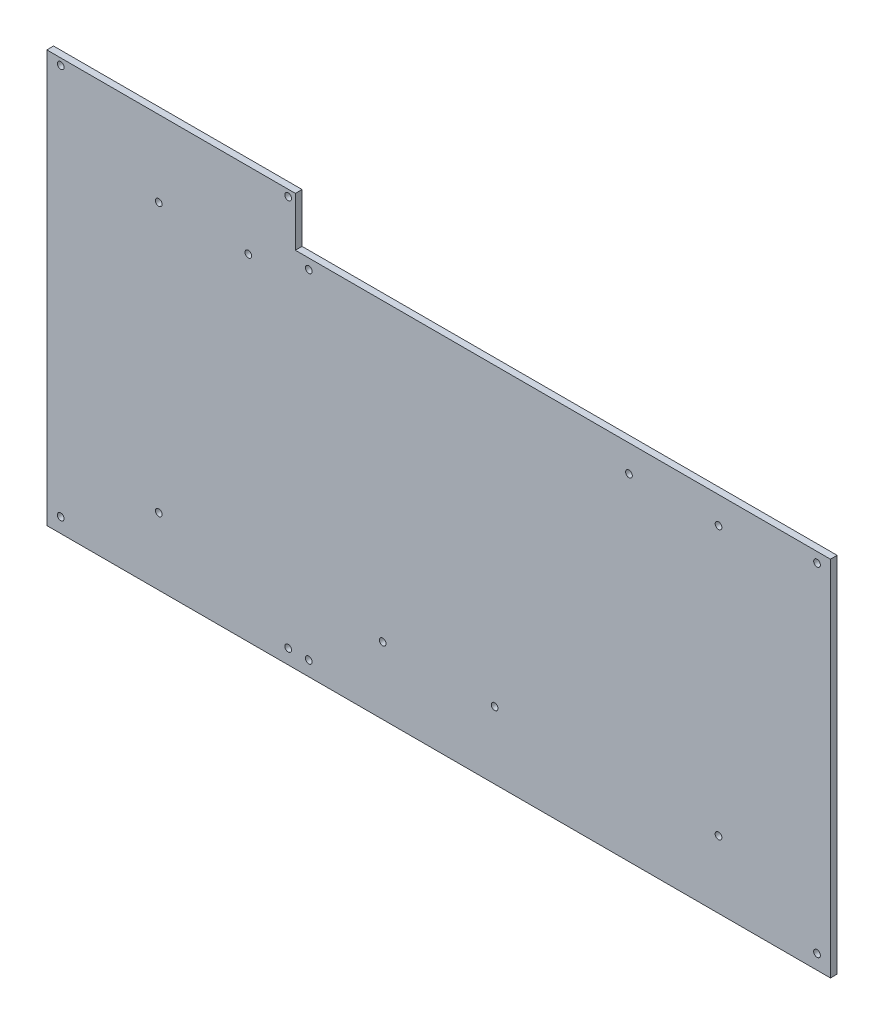
ISO-10303-21;
HEADER;
FILE_DESCRIPTION(('STEP AP214'),'2;1');
FILE_NAME('part.step','',(''),(''),'','','');
FILE_SCHEMA(('AUTOMOTIVE_DESIGN { 1 0 10303 214 1 1 1 1 }'));
ENDSEC;
DATA;
#1=APPLICATION_CONTEXT('core data for automotive mechanical design processes');
#2=APPLICATION_PROTOCOL_DEFINITION('international standard','automotive_design',2000,#1);
#3=PRODUCT_CONTEXT('',#1,'mechanical');
#4=PRODUCT('Part','Part','',(#3));
#5=PRODUCT_RELATED_PRODUCT_CATEGORY('part','',(#4));
#6=PRODUCT_DEFINITION_FORMATION('','',#4);
#7=PRODUCT_DEFINITION_CONTEXT('part definition',#1,'design');
#8=PRODUCT_DEFINITION('design','',#6,#7);
#9=PRODUCT_DEFINITION_SHAPE('','',#8);
#10=(LENGTH_UNIT() NAMED_UNIT(*) SI_UNIT(.MILLI.,.METRE.));
#11=(NAMED_UNIT(*) PLANE_ANGLE_UNIT() SI_UNIT($,.RADIAN.));
#12=(NAMED_UNIT(*) SI_UNIT($,.STERADIAN.) SOLID_ANGLE_UNIT());
#13=UNCERTAINTY_MEASURE_WITH_UNIT(LENGTH_MEASURE(1.E-05),#10,'distance_accuracy_value','');
#14=(GEOMETRIC_REPRESENTATION_CONTEXT(3) GLOBAL_UNCERTAINTY_ASSIGNED_CONTEXT((#13)) GLOBAL_UNIT_ASSIGNED_CONTEXT((#10,
#11,#12)) REPRESENTATION_CONTEXT('',''));
#15=CARTESIAN_POINT('',(0.,0.,0.));
#16=DIRECTION('',(0.,0.,1.));
#17=DIRECTION('',(1.,0.,0.));
#18=AXIS2_PLACEMENT_3D('',#15,#16,#17);
#19=CARTESIAN_POINT('',(0.,0.,3.));
#20=DIRECTION('',(0.,0.,-1.));
#21=DIRECTION('',(-1.,0.,0.));
#22=AXIS2_PLACEMENT_3D('',#19,#20,#21);
#23=PLANE('',#22);
#24=DIRECTION('',(0.,-1.,0.));
#25=VECTOR('',#24,1.);
#26=CARTESIAN_POINT('',(-158.224852071006,90.9644970414201,3.));
#27=LINE('',#26,#25);
#28=CARTESIAN_POINT('',(-158.224852071006,112.96449704142,3.));
#29=VERTEX_POINT('',#28);
#30=CARTESIAN_POINT('',(-158.224852071006,-71.0355029585799,3.));
#31=VERTEX_POINT('',#30);
#32=EDGE_CURVE('E87',#29,#31,#27,.T.);
#33=ORIENTED_EDGE('',*,*,#32,.T.);
#34=DIRECTION('',(1.,0.,0.));
#35=VECTOR('',#34,1.);
#36=CARTESIAN_POINT('',(-158.224852071006,-71.0355029585799,3.));
#37=LINE('',#36,#35);
#38=CARTESIAN_POINT('',(191.775147928994,-71.0355029585799,3.));
#39=VERTEX_POINT('',#38);
#40=EDGE_CURVE('E144',#31,#39,#37,.T.);
#41=ORIENTED_EDGE('',*,*,#40,.T.);
#42=DIRECTION('',(0.,1.,0.));
#43=VECTOR('',#42,1.);
#44=CARTESIAN_POINT('',(191.775147928994,90.9644970414201,3.));
#45=LINE('',#44,#43);
#46=CARTESIAN_POINT('',(191.775147928994,90.9644970414201,3.));
#47=VERTEX_POINT('',#46);
#48=EDGE_CURVE('E101',#39,#47,#45,.T.);
#49=ORIENTED_EDGE('',*,*,#48,.T.);
#50=DIRECTION('',(-1.,0.,0.));
#51=VECTOR('',#50,1.);
#52=CARTESIAN_POINT('',(-47.2248520710059,90.9644970414201,3.));
#53=LINE('',#52,#51);
#54=CARTESIAN_POINT('',(-47.2248520710059,90.9644970414201,3.));
#55=VERTEX_POINT('',#54);
#56=EDGE_CURVE('E95',#47,#55,#53,.T.);
#57=ORIENTED_EDGE('',*,*,#56,.T.);
#58=DIRECTION('',(0.,1.,0.));
#59=VECTOR('',#58,1.);
#60=CARTESIAN_POINT('',(-47.2248520710059,90.9644970414201,3.));
#61=LINE('',#60,#59);
#62=CARTESIAN_POINT('',(-47.2248520710059,112.96449704142,3.));
#63=VERTEX_POINT('',#62);
#64=EDGE_CURVE('E99',#55,#63,#61,.T.);
#65=ORIENTED_EDGE('',*,*,#64,.T.);
#66=DIRECTION('',(-1.,0.,0.));
#67=VECTOR('',#66,1.);
#68=CARTESIAN_POINT('',(-158.224852071006,112.96449704142,3.));
#69=LINE('',#68,#67);
#70=EDGE_CURVE('E51',#63,#29,#69,.T.);
#71=ORIENTED_EDGE('',*,*,#70,.T.);
#72=EDGE_LOOP('',(#33,#41,#49,#57,#65,#71));
#73=FACE_BOUND('',#72,.T.);
#74=CARTESIAN_POINT('',(-108.224852071004,78.9644970414213,3.));
#75=DIRECTION('',(0.,0.,1.));
#76=DIRECTION('',(1.,0.,0.));
#77=AXIS2_PLACEMENT_3D('',#74,#75,#76);
#78=CIRCLE('',#77,1.50000000000019);
#79=CARTESIAN_POINT('',(-106.724852071004,78.9644970414213,3.));
#80=VERTEX_POINT('',#79);
#81=EDGE_CURVE('E121',#80,#80,#78,.T.);
#82=ORIENTED_EDGE('',*,*,#81,.F.);
#83=EDGE_LOOP('',(#82));
#84=FACE_BOUND('',#83,.T.);
#85=CARTESIAN_POINT('',(-68.2248520710051,78.9644970414217,3.));
#86=DIRECTION('',(0.,0.,1.));
#87=DIRECTION('',(1.,0.,0.));
#88=AXIS2_PLACEMENT_3D('',#85,#86,#87);
#89=CIRCLE('',#88,1.50000000000014);
#90=CARTESIAN_POINT('',(-66.7248520710049,78.9644970414217,3.));
#91=VERTEX_POINT('',#90);
#92=EDGE_CURVE('E151',#91,#91,#89,.T.);
#93=ORIENTED_EDGE('',*,*,#92,.F.);
#94=EDGE_LOOP('',(#93));
#95=FACE_BOUND('',#94,.T.);
#96=CARTESIAN_POINT('',(101.775147928995,78.9644970414224,3.));
#97=DIRECTION('',(0.,0.,1.));
#98=DIRECTION('',(1.,0.,0.));
#99=AXIS2_PLACEMENT_3D('',#96,#97,#98);
#100=CIRCLE('',#99,1.50000000000014);
#101=CARTESIAN_POINT('',(103.275147928995,78.9644970414224,3.));
#102=VERTEX_POINT('',#101);
#103=EDGE_CURVE('E157',#102,#102,#100,.T.);
#104=ORIENTED_EDGE('',*,*,#103,.F.);
#105=EDGE_LOOP('',(#104));
#106=FACE_BOUND('',#105,.T.);
#107=CARTESIAN_POINT('',(141.775147928995,78.964497041422,3.));
#108=DIRECTION('',(0.,0.,1.));
#109=DIRECTION('',(1.,0.,0.));
#110=AXIS2_PLACEMENT_3D('',#107,#108,#109);
#111=CIRCLE('',#110,1.50000000000038);
#112=CARTESIAN_POINT('',(143.275147928996,78.964497041422,3.));
#113=VERTEX_POINT('',#112);
#114=EDGE_CURVE('E163',#113,#113,#111,.T.);
#115=ORIENTED_EDGE('',*,*,#114,.F.);
#116=EDGE_LOOP('',(#115));
#117=FACE_BOUND('',#116,.T.);
#118=CARTESIAN_POINT('',(141.775147928995,-41.0355029585782,3.));
#119=DIRECTION('',(0.,0.,1.));
#120=DIRECTION('',(1.,0.,0.));
#121=AXIS2_PLACEMENT_3D('',#118,#119,#120);
#122=CIRCLE('',#121,1.50000000000029);
#123=CARTESIAN_POINT('',(143.275147928995,-41.0355029585782,3.));
#124=VERTEX_POINT('',#123);
#125=EDGE_CURVE('E169',#124,#124,#122,.T.);
#126=ORIENTED_EDGE('',*,*,#125,.F.);
#127=EDGE_LOOP('',(#126));
#128=FACE_BOUND('',#127,.T.);
#129=CARTESIAN_POINT('',(41.7751479289948,-41.0355029585771,3.));
#130=DIRECTION('',(0.,0.,1.));
#131=DIRECTION('',(1.,0.,0.));
#132=AXIS2_PLACEMENT_3D('',#129,#130,#131);
#133=CIRCLE('',#132,1.5000000000004);
#134=CARTESIAN_POINT('',(43.2751479289952,-41.0355029585771,3.));
#135=VERTEX_POINT('',#134);
#136=EDGE_CURVE('E175',#135,#135,#133,.T.);
#137=ORIENTED_EDGE('',*,*,#136,.F.);
#138=EDGE_LOOP('',(#137));
#139=FACE_BOUND('',#138,.T.);
#140=CARTESIAN_POINT('',(-8.22485207100385,-41.0355029585778,3.));
#141=DIRECTION('',(0.,0.,1.));
#142=DIRECTION('',(1.,0.,0.));
#143=AXIS2_PLACEMENT_3D('',#140,#141,#142);
#144=CIRCLE('',#143,1.50000000000027);
#145=CARTESIAN_POINT('',(-6.72485207100357,-41.0355029585778,3.));
#146=VERTEX_POINT('',#145);
#147=EDGE_CURVE('E181',#146,#146,#144,.T.);
#148=ORIENTED_EDGE('',*,*,#147,.F.);
#149=EDGE_LOOP('',(#148));
#150=FACE_BOUND('',#149,.T.);
#151=CARTESIAN_POINT('',(-108.224852071003,-41.0355029585788,3.));
#152=DIRECTION('',(0.,0.,1.));
#153=DIRECTION('',(1.,0.,0.));
#154=AXIS2_PLACEMENT_3D('',#151,#152,#153);
#155=CIRCLE('',#154,1.50000000000033);
#156=CARTESIAN_POINT('',(-106.724852071003,-41.0355029585788,3.));
#157=VERTEX_POINT('',#156);
#158=EDGE_CURVE('E187',#157,#157,#155,.T.);
#159=ORIENTED_EDGE('',*,*,#158,.F.);
#160=EDGE_LOOP('',(#159));
#161=FACE_BOUND('',#160,.T.);
#162=CARTESIAN_POINT('',(-152.024852071008,110.064497041419,3.));
#163=DIRECTION('',(0.,0.,1.));
#164=DIRECTION('',(1.,0.,0.));
#165=AXIS2_PLACEMENT_3D('',#162,#163,#164);
#166=CIRCLE('',#165,1.5);
#167=CARTESIAN_POINT('',(-150.524852071008,110.064497041419,3.));
#168=VERTEX_POINT('',#167);
#169=EDGE_CURVE('E193',#168,#168,#166,.T.);
#170=ORIENTED_EDGE('',*,*,#169,.F.);
#171=EDGE_LOOP('',(#170));
#172=FACE_BOUND('',#171,.T.);
#173=CARTESIAN_POINT('',(-50.4248520710083,110.064497041419,3.));
#174=DIRECTION('',(0.,0.,1.));
#175=DIRECTION('',(1.,0.,0.));
#176=AXIS2_PLACEMENT_3D('',#173,#174,#175);
#177=CIRCLE('',#176,1.5);
#178=CARTESIAN_POINT('',(-48.9248520710083,110.064497041419,3.));
#179=VERTEX_POINT('',#178);
#180=EDGE_CURVE('E199',#179,#179,#177,.T.);
#181=ORIENTED_EDGE('',*,*,#180,.F.);
#182=EDGE_LOOP('',(#181));
#183=FACE_BOUND('',#182,.T.);
#184=CARTESIAN_POINT('',(-41.2248520710059,86.4644970414201,3.));
#185=DIRECTION('',(0.,0.,1.));
#186=DIRECTION('',(1.,0.,0.));
#187=AXIS2_PLACEMENT_3D('',#184,#185,#186);
#188=CIRCLE('',#187,1.5);
#189=CARTESIAN_POINT('',(-39.7248520710059,86.4644970414201,3.));
#190=VERTEX_POINT('',#189);
#191=EDGE_CURVE('E205',#190,#190,#188,.T.);
#192=ORIENTED_EDGE('',*,*,#191,.F.);
#193=EDGE_LOOP('',(#192));
#194=FACE_BOUND('',#193,.T.);
#195=CARTESIAN_POINT('',(185.775147928994,86.4644970414201,3.));
#196=DIRECTION('',(0.,0.,1.));
#197=DIRECTION('',(1.,0.,0.));
#198=AXIS2_PLACEMENT_3D('',#195,#196,#197);
#199=CIRCLE('',#198,1.5);
#200=CARTESIAN_POINT('',(187.275147928994,86.4644970414201,3.));
#201=VERTEX_POINT('',#200);
#202=EDGE_CURVE('E211',#201,#201,#199,.T.);
#203=ORIENTED_EDGE('',*,*,#202,.F.);
#204=EDGE_LOOP('',(#203));
#205=FACE_BOUND('',#204,.T.);
#206=CARTESIAN_POINT('',(185.775147928994,-64.5355029585799,3.));
#207=DIRECTION('',(0.,0.,1.));
#208=DIRECTION('',(1.,0.,0.));
#209=AXIS2_PLACEMENT_3D('',#206,#207,#208);
#210=CIRCLE('',#209,1.5);
#211=CARTESIAN_POINT('',(187.275147928994,-64.5355029585799,3.));
#212=VERTEX_POINT('',#211);
#213=EDGE_CURVE('E217',#212,#212,#210,.T.);
#214=ORIENTED_EDGE('',*,*,#213,.F.);
#215=EDGE_LOOP('',(#214));
#216=FACE_BOUND('',#215,.T.);
#217=CARTESIAN_POINT('',(-41.2248520710059,-64.5355029585799,3.));
#218=DIRECTION('',(0.,0.,1.));
#219=DIRECTION('',(1.,0.,0.));
#220=AXIS2_PLACEMENT_3D('',#217,#218,#219);
#221=CIRCLE('',#220,1.5);
#222=CARTESIAN_POINT('',(-39.7248520710059,-64.5355029585799,3.));
#223=VERTEX_POINT('',#222);
#224=EDGE_CURVE('E223',#223,#223,#221,.T.);
#225=ORIENTED_EDGE('',*,*,#224,.F.);
#226=EDGE_LOOP('',(#225));
#227=FACE_BOUND('',#226,.T.);
#228=CARTESIAN_POINT('',(-50.4248520710077,-64.5355029585811,3.));
#229=DIRECTION('',(0.,0.,1.));
#230=DIRECTION('',(1.,0.,0.));
#231=AXIS2_PLACEMENT_3D('',#228,#229,#230);
#232=CIRCLE('',#231,1.5);
#233=CARTESIAN_POINT('',(-48.9248520710077,-64.5355029585811,3.));
#234=VERTEX_POINT('',#233);
#235=EDGE_CURVE('E229',#234,#234,#232,.T.);
#236=ORIENTED_EDGE('',*,*,#235,.F.);
#237=EDGE_LOOP('',(#236));
#238=FACE_BOUND('',#237,.T.);
#239=CARTESIAN_POINT('',(-152.024852071008,-64.5355029585815,3.));
#240=DIRECTION('',(0.,0.,1.));
#241=DIRECTION('',(1.,0.,0.));
#242=AXIS2_PLACEMENT_3D('',#239,#240,#241);
#243=CIRCLE('',#242,1.5);
#244=CARTESIAN_POINT('',(-150.524852071008,-64.5355029585815,3.));
#245=VERTEX_POINT('',#244);
#246=EDGE_CURVE('E235',#245,#245,#243,.T.);
#247=ORIENTED_EDGE('',*,*,#246,.F.);
#248=EDGE_LOOP('',(#247));
#249=FACE_BOUND('',#248,.T.);
#250=ADVANCED_FACE('F34',(#73,#84,#95,#106,#117,#128,#139,#150,#161,#172,#183,#194,#205,#216,
#227,#238,#249),#23,.F.);
#251=CARTESIAN_POINT('',(0.,0.,0.));
#252=DIRECTION('',(0.,0.,-1.));
#253=DIRECTION('',(-1.,0.,0.));
#254=AXIS2_PLACEMENT_3D('',#251,#252,#253);
#255=PLANE('',#254);
#256=CARTESIAN_POINT('',(-50.4248520710077,-64.5355029585811,0.));
#257=DIRECTION('',(0.,0.,1.));
#258=DIRECTION('',(1.,0.,0.));
#259=AXIS2_PLACEMENT_3D('',#256,#257,#258);
#260=CIRCLE('',#259,1.5);
#261=CARTESIAN_POINT('',(-48.9248520710077,-64.5355029585811,0.));
#262=VERTEX_POINT('',#261);
#263=EDGE_CURVE('E232',#262,#262,#260,.T.);
#264=ORIENTED_EDGE('',*,*,#263,.T.);
#265=EDGE_LOOP('',(#264));
#266=FACE_BOUND('',#265,.T.);
#267=CARTESIAN_POINT('',(185.775147928994,-64.5355029585799,0.));
#268=DIRECTION('',(0.,0.,1.));
#269=DIRECTION('',(1.,0.,0.));
#270=AXIS2_PLACEMENT_3D('',#267,#268,#269);
#271=CIRCLE('',#270,1.5);
#272=CARTESIAN_POINT('',(187.275147928994,-64.5355029585799,0.));
#273=VERTEX_POINT('',#272);
#274=EDGE_CURVE('E220',#273,#273,#271,.T.);
#275=ORIENTED_EDGE('',*,*,#274,.T.);
#276=EDGE_LOOP('',(#275));
#277=FACE_BOUND('',#276,.T.);
#278=CARTESIAN_POINT('',(-41.2248520710059,86.4644970414201,0.));
#279=DIRECTION('',(0.,0.,1.));
#280=DIRECTION('',(1.,0.,0.));
#281=AXIS2_PLACEMENT_3D('',#278,#279,#280);
#282=CIRCLE('',#281,1.5);
#283=CARTESIAN_POINT('',(-39.7248520710059,86.4644970414201,0.));
#284=VERTEX_POINT('',#283);
#285=EDGE_CURVE('E208',#284,#284,#282,.T.);
#286=ORIENTED_EDGE('',*,*,#285,.T.);
#287=EDGE_LOOP('',(#286));
#288=FACE_BOUND('',#287,.T.);
#289=CARTESIAN_POINT('',(-152.024852071008,110.064497041419,0.));
#290=DIRECTION('',(0.,0.,1.));
#291=DIRECTION('',(1.,0.,0.));
#292=AXIS2_PLACEMENT_3D('',#289,#290,#291);
#293=CIRCLE('',#292,1.5);
#294=CARTESIAN_POINT('',(-150.524852071008,110.064497041419,0.));
#295=VERTEX_POINT('',#294);
#296=EDGE_CURVE('E196',#295,#295,#293,.T.);
#297=ORIENTED_EDGE('',*,*,#296,.T.);
#298=EDGE_LOOP('',(#297));
#299=FACE_BOUND('',#298,.T.);
#300=CARTESIAN_POINT('',(-8.22485207100385,-41.0355029585778,0.));
#301=DIRECTION('',(0.,0.,1.));
#302=DIRECTION('',(1.,0.,0.));
#303=AXIS2_PLACEMENT_3D('',#300,#301,#302);
#304=CIRCLE('',#303,1.50000000000027);
#305=CARTESIAN_POINT('',(-6.72485207100357,-41.0355029585778,0.));
#306=VERTEX_POINT('',#305);
#307=EDGE_CURVE('E184',#306,#306,#304,.T.);
#308=ORIENTED_EDGE('',*,*,#307,.T.);
#309=EDGE_LOOP('',(#308));
#310=FACE_BOUND('',#309,.T.);
#311=CARTESIAN_POINT('',(141.775147928995,-41.0355029585782,0.));
#312=DIRECTION('',(0.,0.,1.));
#313=DIRECTION('',(1.,0.,0.));
#314=AXIS2_PLACEMENT_3D('',#311,#312,#313);
#315=CIRCLE('',#314,1.50000000000029);
#316=CARTESIAN_POINT('',(143.275147928995,-41.0355029585782,0.));
#317=VERTEX_POINT('',#316);
#318=EDGE_CURVE('E172',#317,#317,#315,.T.);
#319=ORIENTED_EDGE('',*,*,#318,.T.);
#320=EDGE_LOOP('',(#319));
#321=FACE_BOUND('',#320,.T.);
#322=CARTESIAN_POINT('',(101.775147928995,78.9644970414224,0.));
#323=DIRECTION('',(0.,0.,1.));
#324=DIRECTION('',(1.,0.,0.));
#325=AXIS2_PLACEMENT_3D('',#322,#323,#324);
#326=CIRCLE('',#325,1.50000000000014);
#327=CARTESIAN_POINT('',(103.275147928995,78.9644970414224,0.));
#328=VERTEX_POINT('',#327);
#329=EDGE_CURVE('E160',#328,#328,#326,.T.);
#330=ORIENTED_EDGE('',*,*,#329,.T.);
#331=EDGE_LOOP('',(#330));
#332=FACE_BOUND('',#331,.T.);
#333=CARTESIAN_POINT('',(-108.224852071004,78.9644970414213,0.));
#334=DIRECTION('',(0.,0.,1.));
#335=DIRECTION('',(1.,0.,0.));
#336=AXIS2_PLACEMENT_3D('',#333,#334,#335);
#337=CIRCLE('',#336,1.50000000000019);
#338=CARTESIAN_POINT('',(-106.724852071004,78.9644970414213,0.));
#339=VERTEX_POINT('',#338);
#340=EDGE_CURVE('E148',#339,#339,#337,.T.);
#341=ORIENTED_EDGE('',*,*,#340,.T.);
#342=EDGE_LOOP('',(#341));
#343=FACE_BOUND('',#342,.T.);
#344=DIRECTION('',(0.,-1.,0.));
#345=VECTOR('',#344,1.);
#346=CARTESIAN_POINT('',(-158.224852071006,90.9644970414201,0.));
#347=LINE('',#346,#345);
#348=CARTESIAN_POINT('',(-158.224852071006,112.96449704142,0.));
#349=VERTEX_POINT('',#348);
#350=CARTESIAN_POINT('',(-158.224852071006,-71.0355029585799,0.));
#351=VERTEX_POINT('',#350);
#352=EDGE_CURVE('E81',#349,#351,#347,.T.);
#353=ORIENTED_EDGE('',*,*,#352,.F.);
#354=DIRECTION('',(-1.,0.,0.));
#355=VECTOR('',#354,1.);
#356=CARTESIAN_POINT('',(-158.224852071006,112.96449704142,0.));
#357=LINE('',#356,#355);
#358=CARTESIAN_POINT('',(-47.2248520710059,112.96449704142,0.));
#359=VERTEX_POINT('',#358);
#360=EDGE_CURVE('E127',#359,#349,#357,.T.);
#361=ORIENTED_EDGE('',*,*,#360,.F.);
#362=DIRECTION('',(0.,1.,0.));
#363=VECTOR('',#362,1.);
#364=CARTESIAN_POINT('',(-47.2248520710059,90.9644970414201,0.));
#365=LINE('',#364,#363);
#366=CARTESIAN_POINT('',(-47.2248520710059,90.9644970414201,0.));
#367=VERTEX_POINT('',#366);
#368=EDGE_CURVE('E74',#367,#359,#365,.T.);
#369=ORIENTED_EDGE('',*,*,#368,.F.);
#370=DIRECTION('',(-1.,0.,0.));
#371=VECTOR('',#370,1.);
#372=CARTESIAN_POINT('',(-47.2248520710059,90.9644970414201,0.));
#373=LINE('',#372,#371);
#374=CARTESIAN_POINT('',(191.775147928994,90.9644970414201,0.));
#375=VERTEX_POINT('',#374);
#376=EDGE_CURVE('E109',#375,#367,#373,.T.);
#377=ORIENTED_EDGE('',*,*,#376,.F.);
#378=DIRECTION('',(0.,1.,0.));
#379=VECTOR('',#378,1.);
#380=CARTESIAN_POINT('',(191.775147928994,90.9644970414201,0.));
#381=LINE('',#380,#379);
#382=CARTESIAN_POINT('',(191.775147928994,-71.0355029585799,0.));
#383=VERTEX_POINT('',#382);
#384=EDGE_CURVE('E123',#383,#375,#381,.T.);
#385=ORIENTED_EDGE('',*,*,#384,.F.);
#386=DIRECTION('',(1.,0.,0.));
#387=VECTOR('',#386,1.);
#388=CARTESIAN_POINT('',(-158.224852071006,-71.0355029585799,0.));
#389=LINE('',#388,#387);
#390=EDGE_CURVE('E120',#351,#383,#389,.T.);
#391=ORIENTED_EDGE('',*,*,#390,.F.);
#392=EDGE_LOOP('',(#353,#361,#369,#377,#385,#391));
#393=FACE_BOUND('',#392,.T.);
#394=CARTESIAN_POINT('',(-68.2248520710051,78.9644970414217,0.));
#395=DIRECTION('',(0.,0.,1.));
#396=DIRECTION('',(1.,0.,0.));
#397=AXIS2_PLACEMENT_3D('',#394,#395,#396);
#398=CIRCLE('',#397,1.50000000000014);
#399=CARTESIAN_POINT('',(-66.7248520710049,78.9644970414217,0.));
#400=VERTEX_POINT('',#399);
#401=EDGE_CURVE('E154',#400,#400,#398,.T.);
#402=ORIENTED_EDGE('',*,*,#401,.T.);
#403=EDGE_LOOP('',(#402));
#404=FACE_BOUND('',#403,.T.);
#405=CARTESIAN_POINT('',(141.775147928995,78.964497041422,0.));
#406=DIRECTION('',(0.,0.,1.));
#407=DIRECTION('',(1.,0.,0.));
#408=AXIS2_PLACEMENT_3D('',#405,#406,#407);
#409=CIRCLE('',#408,1.50000000000038);
#410=CARTESIAN_POINT('',(143.275147928996,78.964497041422,0.));
#411=VERTEX_POINT('',#410);
#412=EDGE_CURVE('E166',#411,#411,#409,.T.);
#413=ORIENTED_EDGE('',*,*,#412,.T.);
#414=EDGE_LOOP('',(#413));
#415=FACE_BOUND('',#414,.T.);
#416=CARTESIAN_POINT('',(41.7751479289948,-41.0355029585771,0.));
#417=DIRECTION('',(0.,0.,1.));
#418=DIRECTION('',(1.,0.,0.));
#419=AXIS2_PLACEMENT_3D('',#416,#417,#418);
#420=CIRCLE('',#419,1.5000000000004);
#421=CARTESIAN_POINT('',(43.2751479289952,-41.0355029585771,0.));
#422=VERTEX_POINT('',#421);
#423=EDGE_CURVE('E178',#422,#422,#420,.T.);
#424=ORIENTED_EDGE('',*,*,#423,.T.);
#425=EDGE_LOOP('',(#424));
#426=FACE_BOUND('',#425,.T.);
#427=CARTESIAN_POINT('',(-108.224852071003,-41.0355029585788,0.));
#428=DIRECTION('',(0.,0.,1.));
#429=DIRECTION('',(1.,0.,0.));
#430=AXIS2_PLACEMENT_3D('',#427,#428,#429);
#431=CIRCLE('',#430,1.50000000000033);
#432=CARTESIAN_POINT('',(-106.724852071003,-41.0355029585788,0.));
#433=VERTEX_POINT('',#432);
#434=EDGE_CURVE('E190',#433,#433,#431,.T.);
#435=ORIENTED_EDGE('',*,*,#434,.T.);
#436=EDGE_LOOP('',(#435));
#437=FACE_BOUND('',#436,.T.);
#438=CARTESIAN_POINT('',(-50.4248520710083,110.064497041419,0.));
#439=DIRECTION('',(0.,0.,1.));
#440=DIRECTION('',(1.,0.,0.));
#441=AXIS2_PLACEMENT_3D('',#438,#439,#440);
#442=CIRCLE('',#441,1.5);
#443=CARTESIAN_POINT('',(-48.9248520710083,110.064497041419,0.));
#444=VERTEX_POINT('',#443);
#445=EDGE_CURVE('E202',#444,#444,#442,.T.);
#446=ORIENTED_EDGE('',*,*,#445,.T.);
#447=EDGE_LOOP('',(#446));
#448=FACE_BOUND('',#447,.T.);
#449=CARTESIAN_POINT('',(185.775147928994,86.4644970414201,0.));
#450=DIRECTION('',(0.,0.,1.));
#451=DIRECTION('',(1.,0.,0.));
#452=AXIS2_PLACEMENT_3D('',#449,#450,#451);
#453=CIRCLE('',#452,1.5);
#454=CARTESIAN_POINT('',(187.275147928994,86.4644970414201,0.));
#455=VERTEX_POINT('',#454);
#456=EDGE_CURVE('E214',#455,#455,#453,.T.);
#457=ORIENTED_EDGE('',*,*,#456,.T.);
#458=EDGE_LOOP('',(#457));
#459=FACE_BOUND('',#458,.T.);
#460=CARTESIAN_POINT('',(-41.2248520710059,-64.5355029585799,0.));
#461=DIRECTION('',(0.,0.,1.));
#462=DIRECTION('',(1.,0.,0.));
#463=AXIS2_PLACEMENT_3D('',#460,#461,#462);
#464=CIRCLE('',#463,1.5);
#465=CARTESIAN_POINT('',(-39.7248520710059,-64.5355029585799,0.));
#466=VERTEX_POINT('',#465);
#467=EDGE_CURVE('E226',#466,#466,#464,.T.);
#468=ORIENTED_EDGE('',*,*,#467,.T.);
#469=EDGE_LOOP('',(#468));
#470=FACE_BOUND('',#469,.T.);
#471=CARTESIAN_POINT('',(-152.024852071008,-64.5355029585815,0.));
#472=DIRECTION('',(0.,0.,1.));
#473=DIRECTION('',(1.,0.,0.));
#474=AXIS2_PLACEMENT_3D('',#471,#472,#473);
#475=CIRCLE('',#474,1.5);
#476=CARTESIAN_POINT('',(-150.524852071008,-64.5355029585815,0.));
#477=VERTEX_POINT('',#476);
#478=EDGE_CURVE('E238',#477,#477,#475,.T.);
#479=ORIENTED_EDGE('',*,*,#478,.T.);
#480=EDGE_LOOP('',(#479));
#481=FACE_BOUND('',#480,.T.);
#482=ADVANCED_FACE('F139',(#266,#277,#288,#299,#310,#321,#332,#343,#393,#404,#415,#426,#437,
#448,#459,#470,#481),#255,.T.);
#483=CARTESIAN_POINT('',(-158.224852071006,90.9644970414201,3.));
#484=DIRECTION('',(1.,0.,0.));
#485=DIRECTION('',(0.,1.,0.));
#486=AXIS2_PLACEMENT_3D('',#483,#484,#485);
#487=PLANE('',#486);
#488=ORIENTED_EDGE('',*,*,#352,.T.);
#489=DIRECTION('',(0.,0.,-1.));
#490=VECTOR('',#489,1.);
#491=CARTESIAN_POINT('',(-158.224852071006,-71.0355029585799,3.));
#492=LINE('',#491,#490);
#493=EDGE_CURVE('E11',#31,#351,#492,.T.);
#494=ORIENTED_EDGE('',*,*,#493,.F.);
#495=ORIENTED_EDGE('',*,*,#32,.F.);
#496=DIRECTION('',(0.,0.,-1.));
#497=VECTOR('',#496,1.);
#498=CARTESIAN_POINT('',(-158.224852071006,112.96449704142,3.));
#499=LINE('',#498,#497);
#500=EDGE_CURVE('E115',#29,#349,#499,.T.);
#501=ORIENTED_EDGE('',*,*,#500,.T.);
#502=EDGE_LOOP('',(#488,#494,#495,#501));
#503=FACE_BOUND('',#502,.T.);
#504=ADVANCED_FACE('F36',(#503),#487,.F.);
#505=CARTESIAN_POINT('',(-158.224852071006,-71.0355029585799,3.));
#506=DIRECTION('',(0.,1.,0.));
#507=DIRECTION('',(0.,0.,1.));
#508=AXIS2_PLACEMENT_3D('',#505,#506,#507);
#509=PLANE('',#508);
#510=ORIENTED_EDGE('',*,*,#390,.T.);
#511=DIRECTION('',(0.,0.,-1.));
#512=VECTOR('',#511,1.);
#513=CARTESIAN_POINT('',(191.775147928994,-71.0355029585799,3.));
#514=LINE('',#513,#512);
#515=EDGE_CURVE('E43',#39,#383,#514,.T.);
#516=ORIENTED_EDGE('',*,*,#515,.F.);
#517=ORIENTED_EDGE('',*,*,#40,.F.);
#518=ORIENTED_EDGE('',*,*,#493,.T.);
#519=EDGE_LOOP('',(#510,#516,#517,#518));
#520=FACE_BOUND('',#519,.T.);
#521=ADVANCED_FACE('F265',(#520),#509,.F.);
#522=CARTESIAN_POINT('',(191.775147928994,90.9644970414201,3.));
#523=DIRECTION('',(-1.,0.,0.));
#524=DIRECTION('',(0.,0.,1.));
#525=AXIS2_PLACEMENT_3D('',#522,#523,#524);
#526=PLANE('',#525);
#527=ORIENTED_EDGE('',*,*,#384,.T.);
#528=DIRECTION('',(0.,0.,-1.));
#529=VECTOR('',#528,1.);
#530=CARTESIAN_POINT('',(191.775147928994,90.9644970414201,3.));
#531=LINE('',#530,#529);
#532=EDGE_CURVE('E110',#47,#375,#531,.T.);
#533=ORIENTED_EDGE('',*,*,#532,.F.);
#534=ORIENTED_EDGE('',*,*,#48,.F.);
#535=ORIENTED_EDGE('',*,*,#515,.T.);
#536=EDGE_LOOP('',(#527,#533,#534,#535));
#537=FACE_BOUND('',#536,.T.);
#538=ADVANCED_FACE('F136',(#537),#526,.F.);
#539=CARTESIAN_POINT('',(-47.2248520710059,90.9644970414201,3.));
#540=DIRECTION('',(0.,-1.,0.));
#541=DIRECTION('',(0.,0.,-1.));
#542=AXIS2_PLACEMENT_3D('',#539,#540,#541);
#543=PLANE('',#542);
#544=ORIENTED_EDGE('',*,*,#376,.T.);
#545=DIRECTION('',(0.,0.,-1.));
#546=VECTOR('',#545,1.);
#547=CARTESIAN_POINT('',(-47.2248520710059,90.9644970414201,3.));
#548=LINE('',#547,#546);
#549=EDGE_CURVE('E106',#55,#367,#548,.T.);
#550=ORIENTED_EDGE('',*,*,#549,.F.);
#551=ORIENTED_EDGE('',*,*,#56,.F.);
#552=ORIENTED_EDGE('',*,*,#532,.T.);
#553=EDGE_LOOP('',(#544,#550,#551,#552));
#554=FACE_BOUND('',#553,.T.);
#555=ADVANCED_FACE('F107',(#554),#543,.F.);
#556=CARTESIAN_POINT('',(-47.2248520710059,90.9644970414201,3.));
#557=DIRECTION('',(-1.,0.,0.));
#558=DIRECTION('',(0.,0.,1.));
#559=AXIS2_PLACEMENT_3D('',#556,#557,#558);
#560=PLANE('',#559);
#561=ORIENTED_EDGE('',*,*,#368,.T.);
#562=DIRECTION('',(0.,0.,-1.));
#563=VECTOR('',#562,1.);
#564=CARTESIAN_POINT('',(-47.2248520710059,112.96449704142,3.));
#565=LINE('',#564,#563);
#566=EDGE_CURVE('E111',#63,#359,#565,.T.);
#567=ORIENTED_EDGE('',*,*,#566,.F.);
#568=ORIENTED_EDGE('',*,*,#64,.F.);
#569=ORIENTED_EDGE('',*,*,#549,.T.);
#570=EDGE_LOOP('',(#561,#567,#568,#569));
#571=FACE_BOUND('',#570,.T.);
#572=ADVANCED_FACE('F113',(#571),#560,.F.);
#573=CARTESIAN_POINT('',(-158.224852071006,112.96449704142,3.));
#574=DIRECTION('',(0.,-1.,0.));
#575=DIRECTION('',(0.,0.,-1.));
#576=AXIS2_PLACEMENT_3D('',#573,#574,#575);
#577=PLANE('',#576);
#578=ORIENTED_EDGE('',*,*,#360,.T.);
#579=ORIENTED_EDGE('',*,*,#500,.F.);
#580=ORIENTED_EDGE('',*,*,#70,.F.);
#581=ORIENTED_EDGE('',*,*,#566,.T.);
#582=EDGE_LOOP('',(#578,#579,#580,#581));
#583=FACE_BOUND('',#582,.T.);
#584=ADVANCED_FACE('F142',(#583),#577,.F.);
#585=CARTESIAN_POINT('',(-108.224852071004,78.9644970414213,3.));
#586=DIRECTION('',(0.,0.,-1.));
#587=DIRECTION('',(-1.,0.,0.));
#588=AXIS2_PLACEMENT_3D('',#585,#586,#587);
#589=CYLINDRICAL_SURFACE('',#588,1.50000000000019);
#590=ORIENTED_EDGE('',*,*,#81,.T.);
#591=EDGE_LOOP('',(#590));
#592=FACE_BOUND('',#591,.T.);
#593=ORIENTED_EDGE('',*,*,#340,.F.);
#594=EDGE_LOOP('',(#593));
#595=FACE_BOUND('',#594,.T.);
#596=ADVANCED_FACE('F255',(#592,#595),#589,.F.);
#597=CARTESIAN_POINT('',(-68.2248520710051,78.9644970414217,3.));
#598=DIRECTION('',(0.,0.,-1.));
#599=DIRECTION('',(-1.,0.,0.));
#600=AXIS2_PLACEMENT_3D('',#597,#598,#599);
#601=CYLINDRICAL_SURFACE('',#600,1.50000000000014);
#602=ORIENTED_EDGE('',*,*,#92,.T.);
#603=EDGE_LOOP('',(#602));
#604=FACE_BOUND('',#603,.T.);
#605=ORIENTED_EDGE('',*,*,#401,.F.);
#606=EDGE_LOOP('',(#605));
#607=FACE_BOUND('',#606,.T.);
#608=ADVANCED_FACE('F319',(#604,#607),#601,.F.);
#609=CARTESIAN_POINT('',(101.775147928995,78.9644970414224,3.));
#610=DIRECTION('',(0.,0.,-1.));
#611=DIRECTION('',(-1.,0.,0.));
#612=AXIS2_PLACEMENT_3D('',#609,#610,#611);
#613=CYLINDRICAL_SURFACE('',#612,1.50000000000014);
#614=ORIENTED_EDGE('',*,*,#103,.T.);
#615=EDGE_LOOP('',(#614));
#616=FACE_BOUND('',#615,.T.);
#617=ORIENTED_EDGE('',*,*,#329,.F.);
#618=EDGE_LOOP('',(#617));
#619=FACE_BOUND('',#618,.T.);
#620=ADVANCED_FACE('F327',(#616,#619),#613,.F.);
#621=CARTESIAN_POINT('',(141.775147928995,78.964497041422,3.));
#622=DIRECTION('',(0.,0.,-1.));
#623=DIRECTION('',(-1.,0.,0.));
#624=AXIS2_PLACEMENT_3D('',#621,#622,#623);
#625=CYLINDRICAL_SURFACE('',#624,1.50000000000038);
#626=ORIENTED_EDGE('',*,*,#114,.T.);
#627=EDGE_LOOP('',(#626));
#628=FACE_BOUND('',#627,.T.);
#629=ORIENTED_EDGE('',*,*,#412,.F.);
#630=EDGE_LOOP('',(#629));
#631=FACE_BOUND('',#630,.T.);
#632=ADVANCED_FACE('F335',(#628,#631),#625,.F.);
#633=CARTESIAN_POINT('',(141.775147928995,-41.0355029585782,3.));
#634=DIRECTION('',(0.,0.,-1.));
#635=DIRECTION('',(-1.,0.,0.));
#636=AXIS2_PLACEMENT_3D('',#633,#634,#635);
#637=CYLINDRICAL_SURFACE('',#636,1.50000000000029);
#638=ORIENTED_EDGE('',*,*,#125,.T.);
#639=EDGE_LOOP('',(#638));
#640=FACE_BOUND('',#639,.T.);
#641=ORIENTED_EDGE('',*,*,#318,.F.);
#642=EDGE_LOOP('',(#641));
#643=FACE_BOUND('',#642,.T.);
#644=ADVANCED_FACE('F344',(#640,#643),#637,.F.);
#645=CARTESIAN_POINT('',(41.7751479289948,-41.0355029585771,3.));
#646=DIRECTION('',(0.,0.,-1.));
#647=DIRECTION('',(-1.,0.,0.));
#648=AXIS2_PLACEMENT_3D('',#645,#646,#647);
#649=CYLINDRICAL_SURFACE('',#648,1.5000000000004);
#650=ORIENTED_EDGE('',*,*,#136,.T.);
#651=EDGE_LOOP('',(#650));
#652=FACE_BOUND('',#651,.T.);
#653=ORIENTED_EDGE('',*,*,#423,.F.);
#654=EDGE_LOOP('',(#653));
#655=FACE_BOUND('',#654,.T.);
#656=ADVANCED_FACE('F353',(#652,#655),#649,.F.);
#657=CARTESIAN_POINT('',(-8.22485207100385,-41.0355029585778,3.));
#658=DIRECTION('',(0.,0.,-1.));
#659=DIRECTION('',(-1.,0.,0.));
#660=AXIS2_PLACEMENT_3D('',#657,#658,#659);
#661=CYLINDRICAL_SURFACE('',#660,1.50000000000027);
#662=ORIENTED_EDGE('',*,*,#147,.T.);
#663=EDGE_LOOP('',(#662));
#664=FACE_BOUND('',#663,.T.);
#665=ORIENTED_EDGE('',*,*,#307,.F.);
#666=EDGE_LOOP('',(#665));
#667=FACE_BOUND('',#666,.T.);
#668=ADVANCED_FACE('F362',(#664,#667),#661,.F.);
#669=CARTESIAN_POINT('',(-108.224852071003,-41.0355029585788,3.));
#670=DIRECTION('',(0.,0.,-1.));
#671=DIRECTION('',(-1.,0.,0.));
#672=AXIS2_PLACEMENT_3D('',#669,#670,#671);
#673=CYLINDRICAL_SURFACE('',#672,1.50000000000033);
#674=ORIENTED_EDGE('',*,*,#158,.T.);
#675=EDGE_LOOP('',(#674));
#676=FACE_BOUND('',#675,.T.);
#677=ORIENTED_EDGE('',*,*,#434,.F.);
#678=EDGE_LOOP('',(#677));
#679=FACE_BOUND('',#678,.T.);
#680=ADVANCED_FACE('F371',(#676,#679),#673,.F.);
#681=CARTESIAN_POINT('',(-152.024852071008,110.064497041419,3.));
#682=DIRECTION('',(0.,0.,-1.));
#683=DIRECTION('',(-1.,0.,0.));
#684=AXIS2_PLACEMENT_3D('',#681,#682,#683);
#685=CYLINDRICAL_SURFACE('',#684,1.5);
#686=ORIENTED_EDGE('',*,*,#169,.T.);
#687=EDGE_LOOP('',(#686));
#688=FACE_BOUND('',#687,.T.);
#689=ORIENTED_EDGE('',*,*,#296,.F.);
#690=EDGE_LOOP('',(#689));
#691=FACE_BOUND('',#690,.T.);
#692=ADVANCED_FACE('F380',(#688,#691),#685,.F.);
#693=CARTESIAN_POINT('',(-50.4248520710083,110.064497041419,3.));
#694=DIRECTION('',(0.,0.,-1.));
#695=DIRECTION('',(-1.,0.,0.));
#696=AXIS2_PLACEMENT_3D('',#693,#694,#695);
#697=CYLINDRICAL_SURFACE('',#696,1.5);
#698=ORIENTED_EDGE('',*,*,#180,.T.);
#699=EDGE_LOOP('',(#698));
#700=FACE_BOUND('',#699,.T.);
#701=ORIENTED_EDGE('',*,*,#445,.F.);
#702=EDGE_LOOP('',(#701));
#703=FACE_BOUND('',#702,.T.);
#704=ADVANCED_FACE('F389',(#700,#703),#697,.F.);
#705=CARTESIAN_POINT('',(-41.2248520710059,86.4644970414201,3.));
#706=DIRECTION('',(0.,0.,-1.));
#707=DIRECTION('',(-1.,0.,0.));
#708=AXIS2_PLACEMENT_3D('',#705,#706,#707);
#709=CYLINDRICAL_SURFACE('',#708,1.5);
#710=ORIENTED_EDGE('',*,*,#191,.T.);
#711=EDGE_LOOP('',(#710));
#712=FACE_BOUND('',#711,.T.);
#713=ORIENTED_EDGE('',*,*,#285,.F.);
#714=EDGE_LOOP('',(#713));
#715=FACE_BOUND('',#714,.T.);
#716=ADVANCED_FACE('F398',(#712,#715),#709,.F.);
#717=CARTESIAN_POINT('',(185.775147928994,86.4644970414201,3.));
#718=DIRECTION('',(0.,0.,-1.));
#719=DIRECTION('',(-1.,0.,0.));
#720=AXIS2_PLACEMENT_3D('',#717,#718,#719);
#721=CYLINDRICAL_SURFACE('',#720,1.5);
#722=ORIENTED_EDGE('',*,*,#202,.T.);
#723=EDGE_LOOP('',(#722));
#724=FACE_BOUND('',#723,.T.);
#725=ORIENTED_EDGE('',*,*,#456,.F.);
#726=EDGE_LOOP('',(#725));
#727=FACE_BOUND('',#726,.T.);
#728=ADVANCED_FACE('F407',(#724,#727),#721,.F.);
#729=CARTESIAN_POINT('',(185.775147928994,-64.5355029585799,3.));
#730=DIRECTION('',(0.,0.,-1.));
#731=DIRECTION('',(-1.,0.,0.));
#732=AXIS2_PLACEMENT_3D('',#729,#730,#731);
#733=CYLINDRICAL_SURFACE('',#732,1.5);
#734=ORIENTED_EDGE('',*,*,#213,.T.);
#735=EDGE_LOOP('',(#734));
#736=FACE_BOUND('',#735,.T.);
#737=ORIENTED_EDGE('',*,*,#274,.F.);
#738=EDGE_LOOP('',(#737));
#739=FACE_BOUND('',#738,.T.);
#740=ADVANCED_FACE('F416',(#736,#739),#733,.F.);
#741=CARTESIAN_POINT('',(-41.2248520710059,-64.5355029585799,3.));
#742=DIRECTION('',(0.,0.,-1.));
#743=DIRECTION('',(-1.,0.,0.));
#744=AXIS2_PLACEMENT_3D('',#741,#742,#743);
#745=CYLINDRICAL_SURFACE('',#744,1.5);
#746=ORIENTED_EDGE('',*,*,#224,.T.);
#747=EDGE_LOOP('',(#746));
#748=FACE_BOUND('',#747,.T.);
#749=ORIENTED_EDGE('',*,*,#467,.F.);
#750=EDGE_LOOP('',(#749));
#751=FACE_BOUND('',#750,.T.);
#752=ADVANCED_FACE('F425',(#748,#751),#745,.F.);
#753=CARTESIAN_POINT('',(-50.4248520710077,-64.5355029585811,3.));
#754=DIRECTION('',(0.,0.,-1.));
#755=DIRECTION('',(-1.,0.,0.));
#756=AXIS2_PLACEMENT_3D('',#753,#754,#755);
#757=CYLINDRICAL_SURFACE('',#756,1.5);
#758=ORIENTED_EDGE('',*,*,#235,.T.);
#759=EDGE_LOOP('',(#758));
#760=FACE_BOUND('',#759,.T.);
#761=ORIENTED_EDGE('',*,*,#263,.F.);
#762=EDGE_LOOP('',(#761));
#763=FACE_BOUND('',#762,.T.);
#764=ADVANCED_FACE('F434',(#760,#763),#757,.F.);
#765=CARTESIAN_POINT('',(-152.024852071008,-64.5355029585815,3.));
#766=DIRECTION('',(0.,0.,-1.));
#767=DIRECTION('',(-1.,0.,0.));
#768=AXIS2_PLACEMENT_3D('',#765,#766,#767);
#769=CYLINDRICAL_SURFACE('',#768,1.5);
#770=ORIENTED_EDGE('',*,*,#246,.T.);
#771=EDGE_LOOP('',(#770));
#772=FACE_BOUND('',#771,.T.);
#773=ORIENTED_EDGE('',*,*,#478,.F.);
#774=EDGE_LOOP('',(#773));
#775=FACE_BOUND('',#774,.T.);
#776=ADVANCED_FACE('F244',(#772,#775),#769,.F.);
#777=CLOSED_SHELL('',(#250,#482,#504,#521,#538,#555,#572,#584,#596,#608,#620,#632,#644,#656,
#668,#680,#692,#704,#716,#728,#740,#752,#764,#776));
#778=MANIFOLD_SOLID_BREP('B2',#777);
#779=ADVANCED_BREP_SHAPE_REPRESENTATION('',(#18,#778),#14);
#780=SHAPE_DEFINITION_REPRESENTATION(#9,#779);
ENDSEC;
END-ISO-10303-21;
